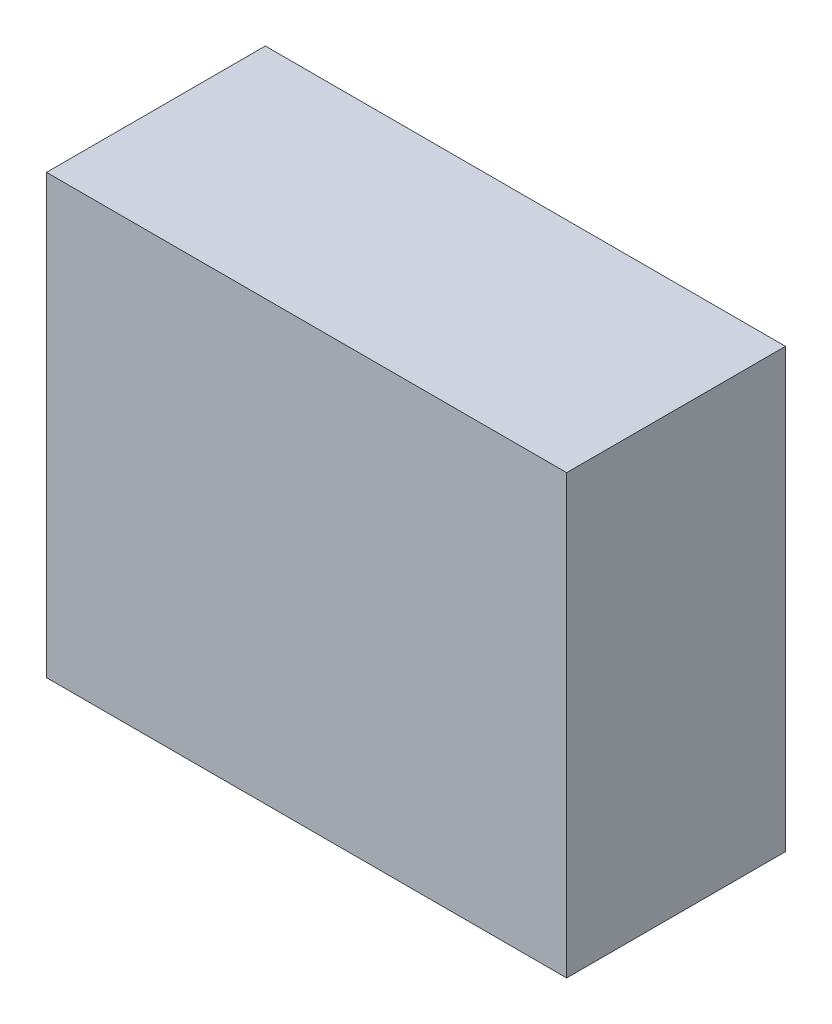
ISO-10303-21;
HEADER;
FILE_DESCRIPTION(('STEP AP214'),'2;1');
FILE_NAME('part.step','',(''),(''),'','','');
FILE_SCHEMA(('AUTOMOTIVE_DESIGN { 1 0 10303 214 1 1 1 1 }'));
ENDSEC;
DATA;
#1=APPLICATION_CONTEXT('core data for automotive mechanical design processes');
#2=APPLICATION_PROTOCOL_DEFINITION('international standard','automotive_design',2000,#1);
#3=PRODUCT_CONTEXT('',#1,'mechanical');
#4=PRODUCT('Part','Part','',(#3));
#5=PRODUCT_RELATED_PRODUCT_CATEGORY('part','',(#4));
#6=PRODUCT_DEFINITION_FORMATION('','',#4);
#7=PRODUCT_DEFINITION_CONTEXT('part definition',#1,'design');
#8=PRODUCT_DEFINITION('design','',#6,#7);
#9=PRODUCT_DEFINITION_SHAPE('','',#8);
#10=(LENGTH_UNIT() NAMED_UNIT(*) SI_UNIT(.MILLI.,.METRE.));
#11=(NAMED_UNIT(*) PLANE_ANGLE_UNIT() SI_UNIT($,.RADIAN.));
#12=(NAMED_UNIT(*) SI_UNIT($,.STERADIAN.) SOLID_ANGLE_UNIT());
#13=UNCERTAINTY_MEASURE_WITH_UNIT(LENGTH_MEASURE(1.E-05),#10,'distance_accuracy_value','');
#14=(GEOMETRIC_REPRESENTATION_CONTEXT(3) GLOBAL_UNCERTAINTY_ASSIGNED_CONTEXT((#13)) GLOBAL_UNIT_ASSIGNED_CONTEXT((#10,
#11,#12)) REPRESENTATION_CONTEXT('',''));
#15=CARTESIAN_POINT('',(0.,0.,0.));
#16=DIRECTION('',(0.,0.,1.));
#17=DIRECTION('',(1.,0.,0.));
#18=AXIS2_PLACEMENT_3D('',#15,#16,#17);
#19=CARTESIAN_POINT('',(14.5,6.1,-3.05));
#20=DIRECTION('',(0.,-1.,0.));
#21=DIRECTION('',(0.,0.,-1.));
#22=AXIS2_PLACEMENT_3D('',#19,#20,#21);
#23=PLANE('',#22);
#24=DIRECTION('',(0.,0.,1.));
#25=VECTOR('',#24,1.);
#26=CARTESIAN_POINT('',(0.,6.1,-3.05));
#27=LINE('',#26,#25);
#28=CARTESIAN_POINT('',(0.,6.1,-3.05));
#29=VERTEX_POINT('',#28);
#30=CARTESIAN_POINT('',(0.,6.1,3.05));
#31=VERTEX_POINT('',#30);
#32=EDGE_CURVE('E102',#29,#31,#27,.T.);
#33=ORIENTED_EDGE('',*,*,#32,.T.);
#34=DIRECTION('',(-1.,0.,0.));
#35=VECTOR('',#34,1.);
#36=CARTESIAN_POINT('',(14.5,6.1,3.05));
#37=LINE('',#36,#35);
#38=CARTESIAN_POINT('',(14.5,6.1,3.05));
#39=VERTEX_POINT('',#38);
#40=EDGE_CURVE('E11',#39,#31,#37,.T.);
#41=ORIENTED_EDGE('',*,*,#40,.F.);
#42=DIRECTION('',(0.,0.,1.));
#43=VECTOR('',#42,1.);
#44=CARTESIAN_POINT('',(14.5,6.1,-3.05));
#45=LINE('',#44,#43);
#46=CARTESIAN_POINT('',(14.5,6.1,-3.05));
#47=VERTEX_POINT('',#46);
#48=EDGE_CURVE('E95',#47,#39,#45,.T.);
#49=ORIENTED_EDGE('',*,*,#48,.F.);
#50=DIRECTION('',(-1.,0.,0.));
#51=VECTOR('',#50,1.);
#52=CARTESIAN_POINT('',(14.5,6.1,-3.05));
#53=LINE('',#52,#51);
#54=EDGE_CURVE('E99',#47,#29,#53,.T.);
#55=ORIENTED_EDGE('',*,*,#54,.T.);
#56=EDGE_LOOP('',(#33,#41,#49,#55));
#57=FACE_BOUND('',#56,.T.);
#58=ADVANCED_FACE('F41',(#57),#23,.F.);
#59=CARTESIAN_POINT('',(14.5,-6.1,3.05));
#60=DIRECTION('',(0.,0.,-1.));
#61=DIRECTION('',(-1.,0.,0.));
#62=AXIS2_PLACEMENT_3D('',#59,#60,#61);
#63=PLANE('',#62);
#64=DIRECTION('',(0.,-1.,0.));
#65=VECTOR('',#64,1.);
#66=CARTESIAN_POINT('',(0.,-6.1,3.05));
#67=LINE('',#66,#65);
#68=CARTESIAN_POINT('',(0.,-6.1,3.05));
#69=VERTEX_POINT('',#68);
#70=EDGE_CURVE('E96',#31,#69,#67,.T.);
#71=ORIENTED_EDGE('',*,*,#70,.T.);
#72=DIRECTION('',(-1.,0.,0.));
#73=VECTOR('',#72,1.);
#74=CARTESIAN_POINT('',(14.5,-6.1,3.05));
#75=LINE('',#74,#73);
#76=CARTESIAN_POINT('',(14.5,-6.1,3.05));
#77=VERTEX_POINT('',#76);
#78=EDGE_CURVE('E47',#77,#69,#75,.T.);
#79=ORIENTED_EDGE('',*,*,#78,.F.);
#80=DIRECTION('',(0.,-1.,0.));
#81=VECTOR('',#80,1.);
#82=CARTESIAN_POINT('',(14.5,-6.1,3.05));
#83=LINE('',#82,#81);
#84=EDGE_CURVE('E87',#39,#77,#83,.T.);
#85=ORIENTED_EDGE('',*,*,#84,.F.);
#86=ORIENTED_EDGE('',*,*,#40,.T.);
#87=EDGE_LOOP('',(#71,#79,#85,#86));
#88=FACE_BOUND('',#87,.T.);
#89=ADVANCED_FACE('F92',(#88),#63,.F.);
#90=CARTESIAN_POINT('',(14.5,-6.1,-3.05));
#91=DIRECTION('',(0.,1.,0.));
#92=DIRECTION('',(0.,0.,1.));
#93=AXIS2_PLACEMENT_3D('',#90,#91,#92);
#94=PLANE('',#93);
#95=DIRECTION('',(0.,0.,-1.));
#96=VECTOR('',#95,1.);
#97=CARTESIAN_POINT('',(0.,-6.1,-3.05));
#98=LINE('',#97,#96);
#99=CARTESIAN_POINT('',(0.,-6.1,-3.05));
#100=VERTEX_POINT('',#99);
#101=EDGE_CURVE('E74',#69,#100,#98,.T.);
#102=ORIENTED_EDGE('',*,*,#101,.T.);
#103=DIRECTION('',(-1.,0.,0.));
#104=VECTOR('',#103,1.);
#105=CARTESIAN_POINT('',(14.5,-6.1,-3.05));
#106=LINE('',#105,#104);
#107=CARTESIAN_POINT('',(14.5,-6.1,-3.05));
#108=VERTEX_POINT('',#107);
#109=EDGE_CURVE('E100',#108,#100,#106,.T.);
#110=ORIENTED_EDGE('',*,*,#109,.F.);
#111=DIRECTION('',(0.,0.,-1.));
#112=VECTOR('',#111,1.);
#113=CARTESIAN_POINT('',(14.5,-6.1,-3.05));
#114=LINE('',#113,#112);
#115=EDGE_CURVE('E89',#77,#108,#114,.T.);
#116=ORIENTED_EDGE('',*,*,#115,.F.);
#117=ORIENTED_EDGE('',*,*,#78,.T.);
#118=EDGE_LOOP('',(#102,#110,#116,#117));
#119=FACE_BOUND('',#118,.T.);
#120=ADVANCED_FACE('F98',(#119),#94,.F.);
#121=CARTESIAN_POINT('',(14.5,-6.1,-3.05));
#122=DIRECTION('',(0.,0.,1.));
#123=DIRECTION('',(1.,0.,0.));
#124=AXIS2_PLACEMENT_3D('',#121,#122,#123);
#125=PLANE('',#124);
#126=DIRECTION('',(0.,1.,0.));
#127=VECTOR('',#126,1.);
#128=CARTESIAN_POINT('',(0.,-6.1,-3.05));
#129=LINE('',#128,#127);
#130=EDGE_CURVE('E78',#100,#29,#129,.T.);
#131=ORIENTED_EDGE('',*,*,#130,.T.);
#132=ORIENTED_EDGE('',*,*,#54,.F.);
#133=DIRECTION('',(0.,1.,0.));
#134=VECTOR('',#133,1.);
#135=CARTESIAN_POINT('',(14.5,-6.1,-3.05));
#136=LINE('',#135,#134);
#137=EDGE_CURVE('E60',#108,#47,#136,.T.);
#138=ORIENTED_EDGE('',*,*,#137,.F.);
#139=ORIENTED_EDGE('',*,*,#109,.T.);
#140=EDGE_LOOP('',(#131,#132,#138,#139));
#141=FACE_BOUND('',#140,.T.);
#142=ADVANCED_FACE('F112',(#141),#125,.F.);
#143=CARTESIAN_POINT('',(14.5,0.,0.));
#144=DIRECTION('',(-1.,0.,0.));
#145=DIRECTION('',(0.,0.,1.));
#146=AXIS2_PLACEMENT_3D('',#143,#144,#145);
#147=PLANE('',#146);
#148=ORIENTED_EDGE('',*,*,#48,.T.);
#149=ORIENTED_EDGE('',*,*,#84,.T.);
#150=ORIENTED_EDGE('',*,*,#115,.T.);
#151=ORIENTED_EDGE('',*,*,#137,.T.);
#152=EDGE_LOOP('',(#148,#149,#150,#151));
#153=FACE_BOUND('',#152,.T.);
#154=ADVANCED_FACE('F86',(#153),#147,.F.);
#155=CARTESIAN_POINT('',(0.,0.,0.));
#156=DIRECTION('',(-1.,0.,0.));
#157=DIRECTION('',(0.,0.,1.));
#158=AXIS2_PLACEMENT_3D('',#155,#156,#157);
#159=PLANE('',#158);
#160=ORIENTED_EDGE('',*,*,#32,.F.);
#161=ORIENTED_EDGE('',*,*,#130,.F.);
#162=ORIENTED_EDGE('',*,*,#101,.F.);
#163=ORIENTED_EDGE('',*,*,#70,.F.);
#164=EDGE_LOOP('',(#160,#161,#162,#163));
#165=FACE_BOUND('',#164,.T.);
#166=ADVANCED_FACE('F111',(#165),#159,.T.);
#167=CLOSED_SHELL('',(#58,#89,#120,#142,#154,#166));
#168=MANIFOLD_SOLID_BREP('B2',#167);
#169=ADVANCED_BREP_SHAPE_REPRESENTATION('',(#18,#168),#14);
#170=SHAPE_DEFINITION_REPRESENTATION(#9,#169);
ENDSEC;
END-ISO-10303-21;
